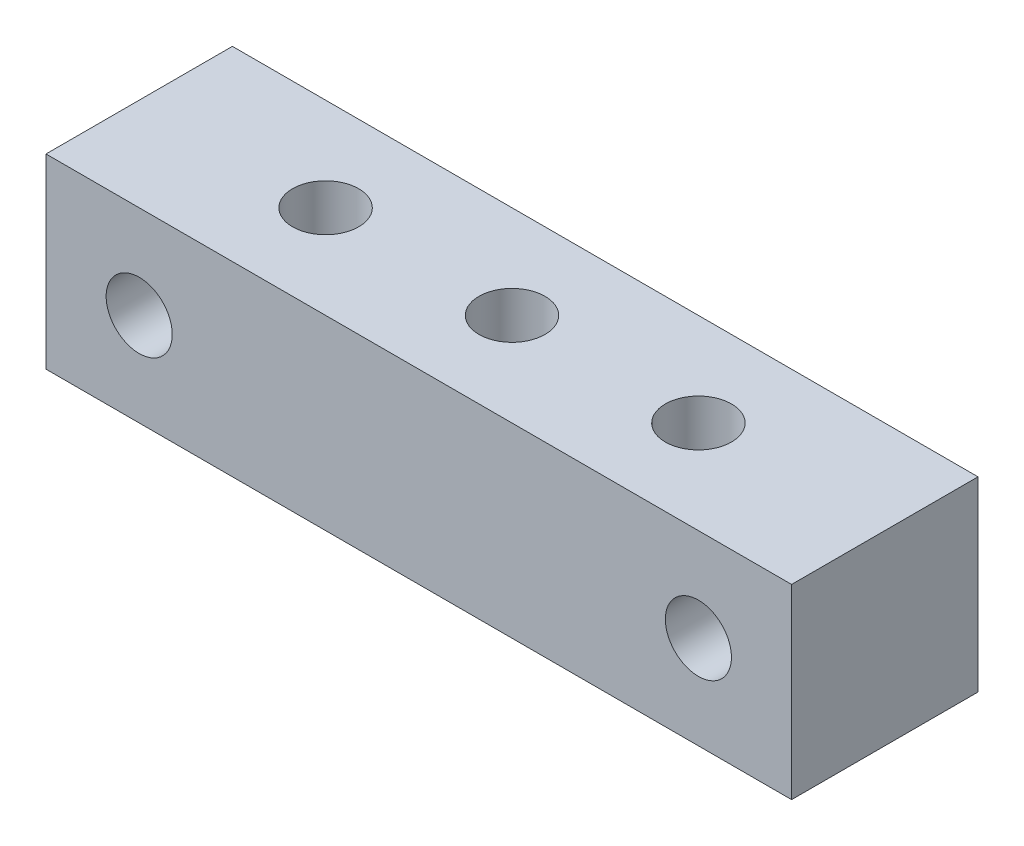
ISO-10303-21;
HEADER;
FILE_DESCRIPTION(('STEP AP214'),'2;1');
FILE_NAME('part.step','',(''),(''),'','','');
FILE_SCHEMA(('AUTOMOTIVE_DESIGN { 1 0 10303 214 1 1 1 1 }'));
ENDSEC;
DATA;
#1=APPLICATION_CONTEXT('core data for automotive mechanical design processes');
#2=APPLICATION_PROTOCOL_DEFINITION('international standard','automotive_design',2000,#1);
#3=PRODUCT_CONTEXT('',#1,'mechanical');
#4=PRODUCT('Part','Part','',(#3));
#5=PRODUCT_RELATED_PRODUCT_CATEGORY('part','',(#4));
#6=PRODUCT_DEFINITION_FORMATION('','',#4);
#7=PRODUCT_DEFINITION_CONTEXT('part definition',#1,'design');
#8=PRODUCT_DEFINITION('design','',#6,#7);
#9=PRODUCT_DEFINITION_SHAPE('','',#8);
#10=(LENGTH_UNIT() NAMED_UNIT(*) SI_UNIT(.MILLI.,.METRE.));
#11=(NAMED_UNIT(*) PLANE_ANGLE_UNIT() SI_UNIT($,.RADIAN.));
#12=(NAMED_UNIT(*) SI_UNIT($,.STERADIAN.) SOLID_ANGLE_UNIT());
#13=UNCERTAINTY_MEASURE_WITH_UNIT(LENGTH_MEASURE(1.E-05),#10,'distance_accuracy_value','');
#14=(GEOMETRIC_REPRESENTATION_CONTEXT(3) GLOBAL_UNCERTAINTY_ASSIGNED_CONTEXT((#13)) GLOBAL_UNIT_ASSIGNED_CONTEXT((#10,
#11,#12)) REPRESENTATION_CONTEXT('',''));
#15=CARTESIAN_POINT('',(0.,0.,0.));
#16=DIRECTION('',(0.,0.,1.));
#17=DIRECTION('',(1.,0.,0.));
#18=AXIS2_PLACEMENT_3D('',#15,#16,#17);
#19=CARTESIAN_POINT('',(38.1,-9.525,19.05));
#20=DIRECTION('',(-1.,0.,0.));
#21=DIRECTION('',(0.,0.,1.));
#22=AXIS2_PLACEMENT_3D('',#19,#20,#21);
#23=PLANE('',#22);
#24=DIRECTION('',(0.,1.,0.));
#25=VECTOR('',#24,1.);
#26=CARTESIAN_POINT('',(38.1,-9.525,0.));
#27=LINE('',#26,#25);
#28=CARTESIAN_POINT('',(38.1,-9.525,0.));
#29=VERTEX_POINT('',#28);
#30=CARTESIAN_POINT('',(38.1,9.52500000000001,0.));
#31=VERTEX_POINT('',#30);
#32=EDGE_CURVE('E98',#29,#31,#27,.T.);
#33=ORIENTED_EDGE('',*,*,#32,.T.);
#34=DIRECTION('',(0.,0.,-1.));
#35=VECTOR('',#34,1.);
#36=CARTESIAN_POINT('',(38.1,9.52500000000001,19.05));
#37=LINE('',#36,#35);
#38=CARTESIAN_POINT('',(38.1,9.52500000000001,19.05));
#39=VERTEX_POINT('',#38);
#40=EDGE_CURVE('E11',#39,#31,#37,.T.);
#41=ORIENTED_EDGE('',*,*,#40,.F.);
#42=DIRECTION('',(0.,1.,0.));
#43=VECTOR('',#42,1.);
#44=CARTESIAN_POINT('',(38.1,-9.525,19.05));
#45=LINE('',#44,#43);
#46=CARTESIAN_POINT('',(38.1,-9.525,19.05));
#47=VERTEX_POINT('',#46);
#48=EDGE_CURVE('E86',#47,#39,#45,.T.);
#49=ORIENTED_EDGE('',*,*,#48,.F.);
#50=DIRECTION('',(0.,0.,-1.));
#51=VECTOR('',#50,1.);
#52=CARTESIAN_POINT('',(38.1,-9.525,19.05));
#53=LINE('',#52,#51);
#54=EDGE_CURVE('E94',#47,#29,#53,.T.);
#55=ORIENTED_EDGE('',*,*,#54,.T.);
#56=EDGE_LOOP('',(#33,#41,#49,#55));
#57=FACE_BOUND('',#56,.T.);
#58=ADVANCED_FACE('F35',(#57),#23,.F.);
#59=CARTESIAN_POINT('',(-38.1,9.52500000000001,19.05));
#60=DIRECTION('',(0.,-1.,0.));
#61=DIRECTION('',(0.,0.,-1.));
#62=AXIS2_PLACEMENT_3D('',#59,#60,#61);
#63=PLANE('',#62);
#64=CARTESIAN_POINT('',(0.,9.52500000000001,9.525));
#65=DIRECTION('',(0.,1.,0.));
#66=DIRECTION('',(0.,0.,1.));
#67=AXIS2_PLACEMENT_3D('',#64,#65,#66);
#68=CIRCLE('',#67,3.37819999999999);
#69=CARTESIAN_POINT('',(0.,9.52500000000001,12.9032));
#70=VERTEX_POINT('',#69);
#71=EDGE_CURVE('E138',#70,#70,#68,.T.);
#72=ORIENTED_EDGE('',*,*,#71,.F.);
#73=EDGE_LOOP('',(#72));
#74=FACE_BOUND('',#73,.T.);
#75=CARTESIAN_POINT('',(-19.05,9.52500000000001,9.525));
#76=DIRECTION('',(0.,1.,0.));
#77=DIRECTION('',(0.,0.,1.));
#78=AXIS2_PLACEMENT_3D('',#75,#76,#77);
#79=CIRCLE('',#78,3.37819999999999);
#80=CARTESIAN_POINT('',(-19.05,9.52500000000001,12.9032));
#81=VERTEX_POINT('',#80);
#82=EDGE_CURVE('E132',#81,#81,#79,.T.);
#83=ORIENTED_EDGE('',*,*,#82,.F.);
#84=EDGE_LOOP('',(#83));
#85=FACE_BOUND('',#84,.T.);
#86=CARTESIAN_POINT('',(19.05,9.52500000000001,9.525));
#87=DIRECTION('',(0.,1.,0.));
#88=DIRECTION('',(0.,0.,1.));
#89=AXIS2_PLACEMENT_3D('',#86,#87,#88);
#90=CIRCLE('',#89,3.37819999999999);
#91=CARTESIAN_POINT('',(19.05,9.52500000000001,12.9032));
#92=VERTEX_POINT('',#91);
#93=EDGE_CURVE('E126',#92,#92,#90,.T.);
#94=ORIENTED_EDGE('',*,*,#93,.F.);
#95=EDGE_LOOP('',(#94));
#96=FACE_BOUND('',#95,.T.);
#97=DIRECTION('',(-1.,0.,0.));
#98=VECTOR('',#97,1.);
#99=CARTESIAN_POINT('',(-38.1,9.52500000000001,0.));
#100=LINE('',#99,#98);
#101=CARTESIAN_POINT('',(-38.1,9.52500000000001,0.));
#102=VERTEX_POINT('',#101);
#103=EDGE_CURVE('E90',#31,#102,#100,.T.);
#104=ORIENTED_EDGE('',*,*,#103,.T.);
#105=DIRECTION('',(0.,0.,-1.));
#106=VECTOR('',#105,1.);
#107=CARTESIAN_POINT('',(-38.1,9.52500000000001,19.05));
#108=LINE('',#107,#106);
#109=CARTESIAN_POINT('',(-38.1,9.52500000000001,19.05));
#110=VERTEX_POINT('',#109);
#111=EDGE_CURVE('E43',#110,#102,#108,.T.);
#112=ORIENTED_EDGE('',*,*,#111,.F.);
#113=DIRECTION('',(-1.,0.,0.));
#114=VECTOR('',#113,1.);
#115=CARTESIAN_POINT('',(-38.1,9.52500000000001,19.05));
#116=LINE('',#115,#114);
#117=EDGE_CURVE('E81',#39,#110,#116,.T.);
#118=ORIENTED_EDGE('',*,*,#117,.F.);
#119=ORIENTED_EDGE('',*,*,#40,.T.);
#120=EDGE_LOOP('',(#104,#112,#118,#119));
#121=FACE_BOUND('',#120,.T.);
#122=ADVANCED_FACE('F89',(#74,#85,#96,#121),#63,.F.);
#123=CARTESIAN_POINT('',(-38.1,-9.525,19.05));
#124=DIRECTION('',(1.,0.,0.));
#125=DIRECTION('',(0.,0.,-1.));
#126=AXIS2_PLACEMENT_3D('',#123,#124,#125);
#127=PLANE('',#126);
#128=DIRECTION('',(0.,-1.,0.));
#129=VECTOR('',#128,1.);
#130=CARTESIAN_POINT('',(-38.1,-9.525,0.));
#131=LINE('',#130,#129);
#132=CARTESIAN_POINT('',(-38.1,-9.525,0.));
#133=VERTEX_POINT('',#132);
#134=EDGE_CURVE('E68',#102,#133,#131,.T.);
#135=ORIENTED_EDGE('',*,*,#134,.T.);
#136=DIRECTION('',(0.,0.,-1.));
#137=VECTOR('',#136,1.);
#138=CARTESIAN_POINT('',(-38.1,-9.525,19.05));
#139=LINE('',#138,#137);
#140=CARTESIAN_POINT('',(-38.1,-9.525,19.05));
#141=VERTEX_POINT('',#140);
#142=EDGE_CURVE('E91',#141,#133,#139,.T.);
#143=ORIENTED_EDGE('',*,*,#142,.F.);
#144=DIRECTION('',(0.,-1.,0.));
#145=VECTOR('',#144,1.);
#146=CARTESIAN_POINT('',(-38.1,-9.525,19.05));
#147=LINE('',#146,#145);
#148=EDGE_CURVE('E84',#110,#141,#147,.T.);
#149=ORIENTED_EDGE('',*,*,#148,.F.);
#150=ORIENTED_EDGE('',*,*,#111,.T.);
#151=EDGE_LOOP('',(#135,#143,#149,#150));
#152=FACE_BOUND('',#151,.T.);
#153=ADVANCED_FACE('F92',(#152),#127,.F.);
#154=CARTESIAN_POINT('',(-38.1,-9.525,19.05));
#155=DIRECTION('',(0.,1.,0.));
#156=DIRECTION('',(0.,0.,1.));
#157=AXIS2_PLACEMENT_3D('',#154,#155,#156);
#158=PLANE('',#157);
#159=CARTESIAN_POINT('',(0.,-9.525,9.525));
#160=DIRECTION('',(0.,1.,0.));
#161=DIRECTION('',(0.,0.,1.));
#162=AXIS2_PLACEMENT_3D('',#159,#160,#161);
#163=CIRCLE('',#162,3.37819999999999);
#164=CARTESIAN_POINT('',(0.,-9.525,12.9032));
#165=VERTEX_POINT('',#164);
#166=EDGE_CURVE('E135',#165,#165,#163,.T.);
#167=ORIENTED_EDGE('',*,*,#166,.T.);
#168=EDGE_LOOP('',(#167));
#169=FACE_BOUND('',#168,.T.);
#170=CARTESIAN_POINT('',(-19.05,-9.525,9.525));
#171=DIRECTION('',(0.,1.,0.));
#172=DIRECTION('',(0.,0.,1.));
#173=AXIS2_PLACEMENT_3D('',#170,#171,#172);
#174=CIRCLE('',#173,3.37819999999999);
#175=CARTESIAN_POINT('',(-19.05,-9.525,12.9032));
#176=VERTEX_POINT('',#175);
#177=EDGE_CURVE('E129',#176,#176,#174,.T.);
#178=ORIENTED_EDGE('',*,*,#177,.T.);
#179=EDGE_LOOP('',(#178));
#180=FACE_BOUND('',#179,.T.);
#181=CARTESIAN_POINT('',(19.05,-9.525,9.525));
#182=DIRECTION('',(0.,1.,0.));
#183=DIRECTION('',(0.,0.,1.));
#184=AXIS2_PLACEMENT_3D('',#181,#182,#183);
#185=CIRCLE('',#184,3.37819999999999);
#186=CARTESIAN_POINT('',(19.05,-9.525,12.9032));
#187=VERTEX_POINT('',#186);
#188=EDGE_CURVE('E123',#187,#187,#185,.T.);
#189=ORIENTED_EDGE('',*,*,#188,.T.);
#190=EDGE_LOOP('',(#189));
#191=FACE_BOUND('',#190,.T.);
#192=DIRECTION('',(1.,0.,0.));
#193=VECTOR('',#192,1.);
#194=CARTESIAN_POINT('',(-38.1,-9.525,0.));
#195=LINE('',#194,#193);
#196=EDGE_CURVE('E74',#133,#29,#195,.T.);
#197=ORIENTED_EDGE('',*,*,#196,.T.);
#198=ORIENTED_EDGE('',*,*,#54,.F.);
#199=DIRECTION('',(1.,0.,0.));
#200=VECTOR('',#199,1.);
#201=CARTESIAN_POINT('',(-38.1,-9.525,19.05));
#202=LINE('',#201,#200);
#203=EDGE_CURVE('E51',#141,#47,#202,.T.);
#204=ORIENTED_EDGE('',*,*,#203,.F.);
#205=ORIENTED_EDGE('',*,*,#142,.T.);
#206=EDGE_LOOP('',(#197,#198,#204,#205));
#207=FACE_BOUND('',#206,.T.);
#208=ADVANCED_FACE('F106',(#169,#180,#191,#207),#158,.F.);
#209=CARTESIAN_POINT('',(0.,0.,19.05));
#210=DIRECTION('',(0.,0.,-1.));
#211=DIRECTION('',(-1.,0.,0.));
#212=AXIS2_PLACEMENT_3D('',#209,#210,#211);
#213=PLANE('',#212);
#214=CARTESIAN_POINT('',(-28.575,0.,19.05));
#215=DIRECTION('',(0.,0.,1.));
#216=DIRECTION('',(1.,0.,0.));
#217=AXIS2_PLACEMENT_3D('',#214,#215,#216);
#218=CIRCLE('',#217,3.3782);
#219=CARTESIAN_POINT('',(-25.1968,0.,19.05));
#220=VERTEX_POINT('',#219);
#221=EDGE_CURVE('E120',#220,#220,#218,.T.);
#222=ORIENTED_EDGE('',*,*,#221,.F.);
#223=EDGE_LOOP('',(#222));
#224=FACE_BOUND('',#223,.T.);
#225=CARTESIAN_POINT('',(28.575,0.,19.05));
#226=DIRECTION('',(0.,0.,1.));
#227=DIRECTION('',(1.,0.,0.));
#228=AXIS2_PLACEMENT_3D('',#225,#226,#227);
#229=CIRCLE('',#228,3.3782);
#230=CARTESIAN_POINT('',(31.9532,0.,19.05));
#231=VERTEX_POINT('',#230);
#232=EDGE_CURVE('E114',#231,#231,#229,.T.);
#233=ORIENTED_EDGE('',*,*,#232,.F.);
#234=EDGE_LOOP('',(#233));
#235=FACE_BOUND('',#234,.T.);
#236=ORIENTED_EDGE('',*,*,#48,.T.);
#237=ORIENTED_EDGE('',*,*,#117,.T.);
#238=ORIENTED_EDGE('',*,*,#148,.T.);
#239=ORIENTED_EDGE('',*,*,#203,.T.);
#240=EDGE_LOOP('',(#236,#237,#238,#239));
#241=FACE_BOUND('',#240,.T.);
#242=ADVANCED_FACE('F82',(#224,#235,#241),#213,.F.);
#243=CARTESIAN_POINT('',(0.,0.,0.));
#244=DIRECTION('',(0.,0.,-1.));
#245=DIRECTION('',(-1.,0.,0.));
#246=AXIS2_PLACEMENT_3D('',#243,#244,#245);
#247=PLANE('',#246);
#248=CARTESIAN_POINT('',(-28.575,0.,0.));
#249=DIRECTION('',(0.,0.,1.));
#250=DIRECTION('',(1.,0.,0.));
#251=AXIS2_PLACEMENT_3D('',#248,#249,#250);
#252=CIRCLE('',#251,3.3782);
#253=CARTESIAN_POINT('',(-25.1968,0.,0.));
#254=VERTEX_POINT('',#253);
#255=EDGE_CURVE('E117',#254,#254,#252,.T.);
#256=ORIENTED_EDGE('',*,*,#255,.T.);
#257=EDGE_LOOP('',(#256));
#258=FACE_BOUND('',#257,.T.);
#259=CARTESIAN_POINT('',(28.575,0.,0.));
#260=DIRECTION('',(0.,0.,1.));
#261=DIRECTION('',(1.,0.,0.));
#262=AXIS2_PLACEMENT_3D('',#259,#260,#261);
#263=CIRCLE('',#262,3.3782);
#264=CARTESIAN_POINT('',(31.9532,0.,0.));
#265=VERTEX_POINT('',#264);
#266=EDGE_CURVE('E101',#265,#265,#263,.T.);
#267=ORIENTED_EDGE('',*,*,#266,.T.);
#268=EDGE_LOOP('',(#267));
#269=FACE_BOUND('',#268,.T.);
#270=ORIENTED_EDGE('',*,*,#32,.F.);
#271=ORIENTED_EDGE('',*,*,#196,.F.);
#272=ORIENTED_EDGE('',*,*,#134,.F.);
#273=ORIENTED_EDGE('',*,*,#103,.F.);
#274=EDGE_LOOP('',(#270,#271,#272,#273));
#275=FACE_BOUND('',#274,.T.);
#276=ADVANCED_FACE('F109',(#258,#269,#275),#247,.T.);
#277=CARTESIAN_POINT('',(28.575,0.,19.05));
#278=DIRECTION('',(0.,0.,1.));
#279=DIRECTION('',(1.,0.,0.));
#280=AXIS2_PLACEMENT_3D('',#277,#278,#279);
#281=CYLINDRICAL_SURFACE('',#280,3.3782);
#282=ORIENTED_EDGE('',*,*,#266,.F.);
#283=EDGE_LOOP('',(#282));
#284=FACE_BOUND('',#283,.T.);
#285=ORIENTED_EDGE('',*,*,#232,.T.);
#286=EDGE_LOOP('',(#285));
#287=FACE_BOUND('',#286,.T.);
#288=ADVANCED_FACE('F162',(#284,#287),#281,.F.);
#289=CARTESIAN_POINT('',(-28.575,0.,19.05));
#290=DIRECTION('',(0.,0.,1.));
#291=DIRECTION('',(1.,0.,0.));
#292=AXIS2_PLACEMENT_3D('',#289,#290,#291);
#293=CYLINDRICAL_SURFACE('',#292,3.3782);
#294=ORIENTED_EDGE('',*,*,#255,.F.);
#295=EDGE_LOOP('',(#294));
#296=FACE_BOUND('',#295,.T.);
#297=ORIENTED_EDGE('',*,*,#221,.T.);
#298=EDGE_LOOP('',(#297));
#299=FACE_BOUND('',#298,.T.);
#300=ADVANCED_FACE('F153',(#296,#299),#293,.F.);
#301=CARTESIAN_POINT('',(19.05,9.52500000000001,9.525));
#302=DIRECTION('',(0.,1.,0.));
#303=DIRECTION('',(0.,0.,1.));
#304=AXIS2_PLACEMENT_3D('',#301,#302,#303);
#305=CYLINDRICAL_SURFACE('',#304,3.37819999999999);
#306=ORIENTED_EDGE('',*,*,#188,.F.);
#307=EDGE_LOOP('',(#306));
#308=FACE_BOUND('',#307,.T.);
#309=ORIENTED_EDGE('',*,*,#93,.T.);
#310=EDGE_LOOP('',(#309));
#311=FACE_BOUND('',#310,.T.);
#312=ADVANCED_FACE('F150',(#308,#311),#305,.F.);
#313=CARTESIAN_POINT('',(-19.05,9.52500000000001,9.525));
#314=DIRECTION('',(0.,1.,0.));
#315=DIRECTION('',(0.,0.,1.));
#316=AXIS2_PLACEMENT_3D('',#313,#314,#315);
#317=CYLINDRICAL_SURFACE('',#316,3.37819999999999);
#318=ORIENTED_EDGE('',*,*,#177,.F.);
#319=EDGE_LOOP('',(#318));
#320=FACE_BOUND('',#319,.T.);
#321=ORIENTED_EDGE('',*,*,#82,.T.);
#322=EDGE_LOOP('',(#321));
#323=FACE_BOUND('',#322,.T.);
#324=ADVANCED_FACE('F152',(#320,#323),#317,.F.);
#325=CARTESIAN_POINT('',(0.,9.52500000000001,9.525));
#326=DIRECTION('',(0.,1.,0.));
#327=DIRECTION('',(0.,0.,1.));
#328=AXIS2_PLACEMENT_3D('',#325,#326,#327);
#329=CYLINDRICAL_SURFACE('',#328,3.37819999999999);
#330=ORIENTED_EDGE('',*,*,#166,.F.);
#331=EDGE_LOOP('',(#330));
#332=FACE_BOUND('',#331,.T.);
#333=ORIENTED_EDGE('',*,*,#71,.T.);
#334=EDGE_LOOP('',(#333));
#335=FACE_BOUND('',#334,.T.);
#336=ADVANCED_FACE('F142',(#332,#335),#329,.F.);
#337=CLOSED_SHELL('',(#58,#122,#153,#208,#242,#276,#288,#300,#312,#324,#336));
#338=MANIFOLD_SOLID_BREP('B2',#337);
#339=ADVANCED_BREP_SHAPE_REPRESENTATION('',(#18,#338),#14);
#340=SHAPE_DEFINITION_REPRESENTATION(#9,#339);
ENDSEC;
END-ISO-10303-21;
